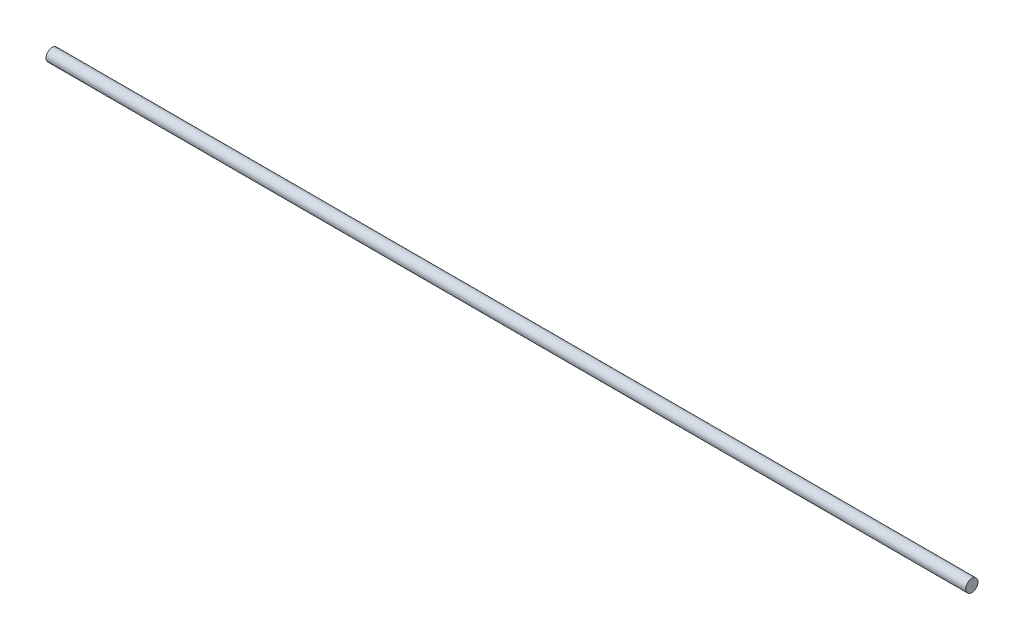
ISO-10303-21;
HEADER;
FILE_DESCRIPTION(('STEP AP214'),'2;1');
FILE_NAME('part.step','',(''),(''),'','','');
FILE_SCHEMA(('AUTOMOTIVE_DESIGN { 1 0 10303 214 1 1 1 1 }'));
ENDSEC;
DATA;
#1=APPLICATION_CONTEXT('core data for automotive mechanical design processes');
#2=APPLICATION_PROTOCOL_DEFINITION('international standard','automotive_design',2000,#1);
#3=PRODUCT_CONTEXT('',#1,'mechanical');
#4=PRODUCT('Part','Part','',(#3));
#5=PRODUCT_RELATED_PRODUCT_CATEGORY('part','',(#4));
#6=PRODUCT_DEFINITION_FORMATION('','',#4);
#7=PRODUCT_DEFINITION_CONTEXT('part definition',#1,'design');
#8=PRODUCT_DEFINITION('design','',#6,#7);
#9=PRODUCT_DEFINITION_SHAPE('','',#8);
#10=(LENGTH_UNIT() NAMED_UNIT(*) SI_UNIT(.MILLI.,.METRE.));
#11=(NAMED_UNIT(*) PLANE_ANGLE_UNIT() SI_UNIT($,.RADIAN.));
#12=(NAMED_UNIT(*) SI_UNIT($,.STERADIAN.) SOLID_ANGLE_UNIT());
#13=UNCERTAINTY_MEASURE_WITH_UNIT(LENGTH_MEASURE(1.E-05),#10,'distance_accuracy_value','');
#14=(GEOMETRIC_REPRESENTATION_CONTEXT(3) GLOBAL_UNCERTAINTY_ASSIGNED_CONTEXT((#13)) GLOBAL_UNIT_ASSIGNED_CONTEXT((#10,
#11,#12)) REPRESENTATION_CONTEXT('',''));
#15=CARTESIAN_POINT('',(0.,0.,0.));
#16=DIRECTION('',(0.,0.,1.));
#17=DIRECTION('',(1.,0.,0.));
#18=AXIS2_PLACEMENT_3D('',#15,#16,#17);
#19=CARTESIAN_POINT('',(300.,0.,0.));
#20=DIRECTION('',(-1.,0.,0.));
#21=DIRECTION('',(0.,0.,1.));
#22=AXIS2_PLACEMENT_3D('',#19,#20,#21);
#23=CYLINDRICAL_SURFACE('',#22,4.);
#24=CARTESIAN_POINT('',(300.,0.,0.));
#25=DIRECTION('',(1.,0.,0.));
#26=DIRECTION('',(0.,0.,-1.));
#27=AXIS2_PLACEMENT_3D('',#24,#25,#26);
#28=CIRCLE('',#27,4.);
#29=CARTESIAN_POINT('',(300.,0.,-4.));
#30=VERTEX_POINT('',#29);
#31=EDGE_CURVE('E10',#30,#30,#28,.T.);
#32=ORIENTED_EDGE('',*,*,#31,.F.);
#33=EDGE_LOOP('',(#32));
#34=FACE_BOUND('',#33,.T.);
#35=CARTESIAN_POINT('',(-300.,0.,0.));
#36=DIRECTION('',(1.,0.,0.));
#37=DIRECTION('',(0.,0.,-1.));
#38=AXIS2_PLACEMENT_3D('',#35,#36,#37);
#39=CIRCLE('',#38,4.);
#40=CARTESIAN_POINT('',(-300.,0.,-4.));
#41=VERTEX_POINT('',#40);
#42=EDGE_CURVE('E40',#41,#41,#39,.T.);
#43=ORIENTED_EDGE('',*,*,#42,.T.);
#44=EDGE_LOOP('',(#43));
#45=FACE_BOUND('',#44,.T.);
#46=ADVANCED_FACE('F37',(#34,#45),#23,.T.);
#47=CARTESIAN_POINT('',(300.,0.,0.));
#48=DIRECTION('',(1.,0.,0.));
#49=DIRECTION('',(0.,0.,-1.));
#50=AXIS2_PLACEMENT_3D('',#47,#48,#49);
#51=PLANE('',#50);
#52=ORIENTED_EDGE('',*,*,#31,.T.);
#53=EDGE_LOOP('',(#52));
#54=FACE_BOUND('',#53,.T.);
#55=ADVANCED_FACE('F54',(#54),#51,.T.);
#56=CARTESIAN_POINT('',(-300.,0.,0.));
#57=DIRECTION('',(1.,0.,0.));
#58=DIRECTION('',(0.,0.,-1.));
#59=AXIS2_PLACEMENT_3D('',#56,#57,#58);
#60=PLANE('',#59);
#61=ORIENTED_EDGE('',*,*,#42,.F.);
#62=EDGE_LOOP('',(#61));
#63=FACE_BOUND('',#62,.T.);
#64=ADVANCED_FACE('F52',(#63),#60,.F.);
#65=CLOSED_SHELL('',(#46,#55,#64));
#66=MANIFOLD_SOLID_BREP('B2',#65);
#67=ADVANCED_BREP_SHAPE_REPRESENTATION('',(#18,#66),#14);
#68=SHAPE_DEFINITION_REPRESENTATION(#9,#67);
ENDSEC;
END-ISO-10303-21;
